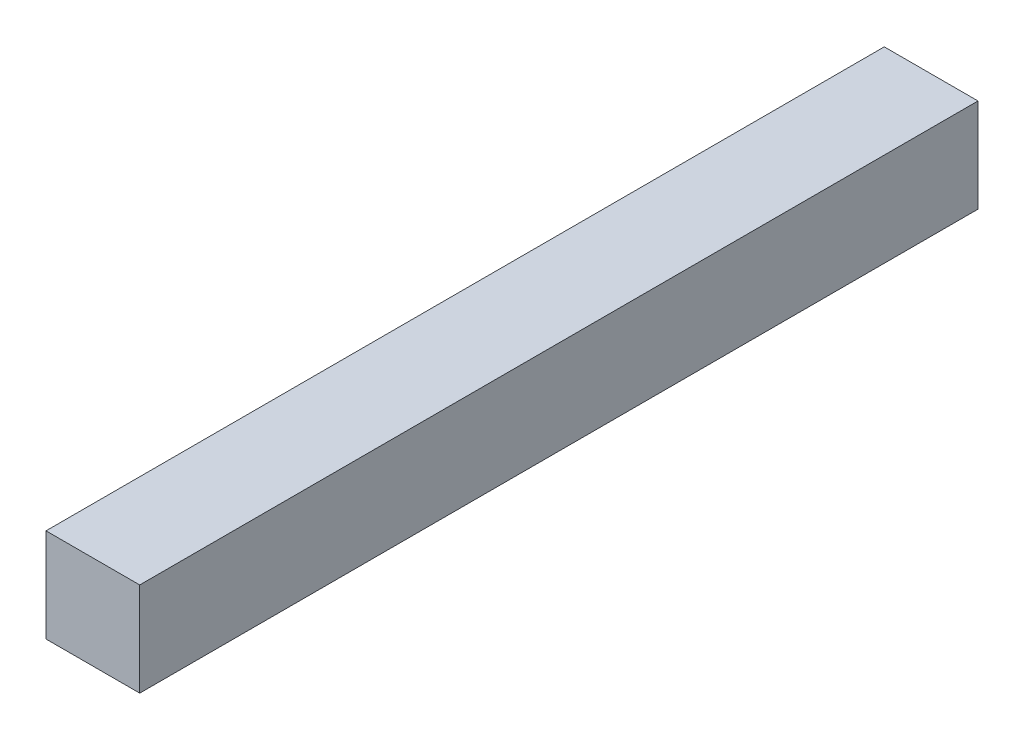
ISO-10303-21;
HEADER;
FILE_DESCRIPTION(('STEP AP214'),'2;1');
FILE_NAME('part.step','',(''),(''),'','','');
FILE_SCHEMA(('AUTOMOTIVE_DESIGN { 1 0 10303 214 1 1 1 1 }'));
ENDSEC;
DATA;
#1=APPLICATION_CONTEXT('core data for automotive mechanical design processes');
#2=APPLICATION_PROTOCOL_DEFINITION('international standard','automotive_design',2000,#1);
#3=PRODUCT_CONTEXT('',#1,'mechanical');
#4=PRODUCT('Part','Part','',(#3));
#5=PRODUCT_RELATED_PRODUCT_CATEGORY('part','',(#4));
#6=PRODUCT_DEFINITION_FORMATION('','',#4);
#7=PRODUCT_DEFINITION_CONTEXT('part definition',#1,'design');
#8=PRODUCT_DEFINITION('design','',#6,#7);
#9=PRODUCT_DEFINITION_SHAPE('','',#8);
#10=(LENGTH_UNIT() NAMED_UNIT(*) SI_UNIT(.MILLI.,.METRE.));
#11=(NAMED_UNIT(*) PLANE_ANGLE_UNIT() SI_UNIT($,.RADIAN.));
#12=(NAMED_UNIT(*) SI_UNIT($,.STERADIAN.) SOLID_ANGLE_UNIT());
#13=UNCERTAINTY_MEASURE_WITH_UNIT(LENGTH_MEASURE(1.E-05),#10,'distance_accuracy_value','');
#14=(GEOMETRIC_REPRESENTATION_CONTEXT(3) GLOBAL_UNCERTAINTY_ASSIGNED_CONTEXT((#13)) GLOBAL_UNIT_ASSIGNED_CONTEXT((#10,
#11,#12)) REPRESENTATION_CONTEXT('',''));
#15=CARTESIAN_POINT('',(0.,0.,0.));
#16=DIRECTION('',(0.,0.,1.));
#17=DIRECTION('',(1.,0.,0.));
#18=AXIS2_PLACEMENT_3D('',#15,#16,#17);
#19=CARTESIAN_POINT('',(-71.,-339.,161.));
#20=DIRECTION('',(-1.,0.,0.));
#21=DIRECTION('',(0.,-1.,0.));
#22=AXIS2_PLACEMENT_3D('',#19,#20,#21);
#23=PLANE('',#22);
#24=DIRECTION('',(0.,1.,0.));
#25=VECTOR('',#24,1.);
#26=CARTESIAN_POINT('',(-71.,-339.,0.));
#27=LINE('',#26,#25);
#28=CARTESIAN_POINT('',(-71.,-339.,0.));
#29=VERTEX_POINT('',#28);
#30=CARTESIAN_POINT('',(-71.,-321.,0.));
#31=VERTEX_POINT('',#30);
#32=EDGE_CURVE('E100',#29,#31,#27,.T.);
#33=ORIENTED_EDGE('',*,*,#32,.T.);
#34=DIRECTION('',(0.,0.,-1.));
#35=VECTOR('',#34,1.);
#36=CARTESIAN_POINT('',(-71.,-321.,161.));
#37=LINE('',#36,#35);
#38=CARTESIAN_POINT('',(-71.,-321.,161.));
#39=VERTEX_POINT('',#38);
#40=EDGE_CURVE('E11',#39,#31,#37,.T.);
#41=ORIENTED_EDGE('',*,*,#40,.F.);
#42=DIRECTION('',(0.,1.,0.));
#43=VECTOR('',#42,1.);
#44=CARTESIAN_POINT('',(-71.,-339.,161.));
#45=LINE('',#44,#43);
#46=CARTESIAN_POINT('',(-71.,-339.,161.));
#47=VERTEX_POINT('',#46);
#48=EDGE_CURVE('E88',#47,#39,#45,.T.);
#49=ORIENTED_EDGE('',*,*,#48,.F.);
#50=DIRECTION('',(0.,0.,-1.));
#51=VECTOR('',#50,1.);
#52=CARTESIAN_POINT('',(-71.,-339.,161.));
#53=LINE('',#52,#51);
#54=EDGE_CURVE('E96',#47,#29,#53,.T.);
#55=ORIENTED_EDGE('',*,*,#54,.T.);
#56=EDGE_LOOP('',(#33,#41,#49,#55));
#57=FACE_BOUND('',#56,.T.);
#58=ADVANCED_FACE('F37',(#57),#23,.F.);
#59=CARTESIAN_POINT('',(-71.,-321.,161.));
#60=DIRECTION('',(0.,-1.,0.));
#61=DIRECTION('',(0.,0.,-1.));
#62=AXIS2_PLACEMENT_3D('',#59,#60,#61);
#63=PLANE('',#62);
#64=DIRECTION('',(-1.,0.,0.));
#65=VECTOR('',#64,1.);
#66=CARTESIAN_POINT('',(-71.,-321.,0.));
#67=LINE('',#66,#65);
#68=CARTESIAN_POINT('',(-89.,-321.,0.));
#69=VERTEX_POINT('',#68);
#70=EDGE_CURVE('E92',#31,#69,#67,.T.);
#71=ORIENTED_EDGE('',*,*,#70,.T.);
#72=DIRECTION('',(0.,0.,-1.));
#73=VECTOR('',#72,1.);
#74=CARTESIAN_POINT('',(-89.,-321.,161.));
#75=LINE('',#74,#73);
#76=CARTESIAN_POINT('',(-89.,-321.,161.));
#77=VERTEX_POINT('',#76);
#78=EDGE_CURVE('E45',#77,#69,#75,.T.);
#79=ORIENTED_EDGE('',*,*,#78,.F.);
#80=DIRECTION('',(-1.,0.,0.));
#81=VECTOR('',#80,1.);
#82=CARTESIAN_POINT('',(-71.,-321.,161.));
#83=LINE('',#82,#81);
#84=EDGE_CURVE('E83',#39,#77,#83,.T.);
#85=ORIENTED_EDGE('',*,*,#84,.F.);
#86=ORIENTED_EDGE('',*,*,#40,.T.);
#87=EDGE_LOOP('',(#71,#79,#85,#86));
#88=FACE_BOUND('',#87,.T.);
#89=ADVANCED_FACE('F91',(#88),#63,.F.);
#90=CARTESIAN_POINT('',(-89.,-321.,161.));
#91=DIRECTION('',(1.,0.,0.));
#92=DIRECTION('',(0.,0.,-1.));
#93=AXIS2_PLACEMENT_3D('',#90,#91,#92);
#94=PLANE('',#93);
#95=DIRECTION('',(0.,-1.,0.));
#96=VECTOR('',#95,1.);
#97=CARTESIAN_POINT('',(-89.,-321.,0.));
#98=LINE('',#97,#96);
#99=CARTESIAN_POINT('',(-89.,-339.,0.));
#100=VERTEX_POINT('',#99);
#101=EDGE_CURVE('E70',#69,#100,#98,.T.);
#102=ORIENTED_EDGE('',*,*,#101,.T.);
#103=DIRECTION('',(0.,0.,-1.));
#104=VECTOR('',#103,1.);
#105=CARTESIAN_POINT('',(-89.,-339.,161.));
#106=LINE('',#105,#104);
#107=CARTESIAN_POINT('',(-89.,-339.,161.));
#108=VERTEX_POINT('',#107);
#109=EDGE_CURVE('E93',#108,#100,#106,.T.);
#110=ORIENTED_EDGE('',*,*,#109,.F.);
#111=DIRECTION('',(0.,-1.,0.));
#112=VECTOR('',#111,1.);
#113=CARTESIAN_POINT('',(-89.,-321.,161.));
#114=LINE('',#113,#112);
#115=EDGE_CURVE('E86',#77,#108,#114,.T.);
#116=ORIENTED_EDGE('',*,*,#115,.F.);
#117=ORIENTED_EDGE('',*,*,#78,.T.);
#118=EDGE_LOOP('',(#102,#110,#116,#117));
#119=FACE_BOUND('',#118,.T.);
#120=ADVANCED_FACE('F94',(#119),#94,.F.);
#121=CARTESIAN_POINT('',(-89.,-339.,161.));
#122=DIRECTION('',(0.,1.,0.));
#123=DIRECTION('',(0.,0.,1.));
#124=AXIS2_PLACEMENT_3D('',#121,#122,#123);
#125=PLANE('',#124);
#126=DIRECTION('',(1.,0.,0.));
#127=VECTOR('',#126,1.);
#128=CARTESIAN_POINT('',(-89.,-339.,0.));
#129=LINE('',#128,#127);
#130=EDGE_CURVE('E76',#100,#29,#129,.T.);
#131=ORIENTED_EDGE('',*,*,#130,.T.);
#132=ORIENTED_EDGE('',*,*,#54,.F.);
#133=DIRECTION('',(1.,0.,0.));
#134=VECTOR('',#133,1.);
#135=CARTESIAN_POINT('',(-89.,-339.,161.));
#136=LINE('',#135,#134);
#137=EDGE_CURVE('E53',#108,#47,#136,.T.);
#138=ORIENTED_EDGE('',*,*,#137,.F.);
#139=ORIENTED_EDGE('',*,*,#109,.T.);
#140=EDGE_LOOP('',(#131,#132,#138,#139));
#141=FACE_BOUND('',#140,.T.);
#142=ADVANCED_FACE('F107',(#141),#125,.F.);
#143=CARTESIAN_POINT('',(0.,0.,161.));
#144=DIRECTION('',(0.,0.,1.));
#145=DIRECTION('',(1.,0.,0.));
#146=AXIS2_PLACEMENT_3D('',#143,#144,#145);
#147=PLANE('',#146);
#148=ORIENTED_EDGE('',*,*,#48,.T.);
#149=ORIENTED_EDGE('',*,*,#84,.T.);
#150=ORIENTED_EDGE('',*,*,#115,.T.);
#151=ORIENTED_EDGE('',*,*,#137,.T.);
#152=EDGE_LOOP('',(#148,#149,#150,#151));
#153=FACE_BOUND('',#152,.T.);
#154=ADVANCED_FACE('F84',(#153),#147,.T.);
#155=CARTESIAN_POINT('',(0.,0.,0.));
#156=DIRECTION('',(0.,0.,1.));
#157=DIRECTION('',(1.,0.,0.));
#158=AXIS2_PLACEMENT_3D('',#155,#156,#157);
#159=PLANE('',#158);
#160=ORIENTED_EDGE('',*,*,#32,.F.);
#161=ORIENTED_EDGE('',*,*,#130,.F.);
#162=ORIENTED_EDGE('',*,*,#101,.F.);
#163=ORIENTED_EDGE('',*,*,#70,.F.);
#164=EDGE_LOOP('',(#160,#161,#162,#163));
#165=FACE_BOUND('',#164,.T.);
#166=ADVANCED_FACE('F110',(#165),#159,.F.);
#167=CLOSED_SHELL('',(#58,#89,#120,#142,#154,#166));
#168=MANIFOLD_SOLID_BREP('B2',#167);
#169=ADVANCED_BREP_SHAPE_REPRESENTATION('',(#18,#168),#14);
#170=SHAPE_DEFINITION_REPRESENTATION(#9,#169);
ENDSEC;
END-ISO-10303-21;
